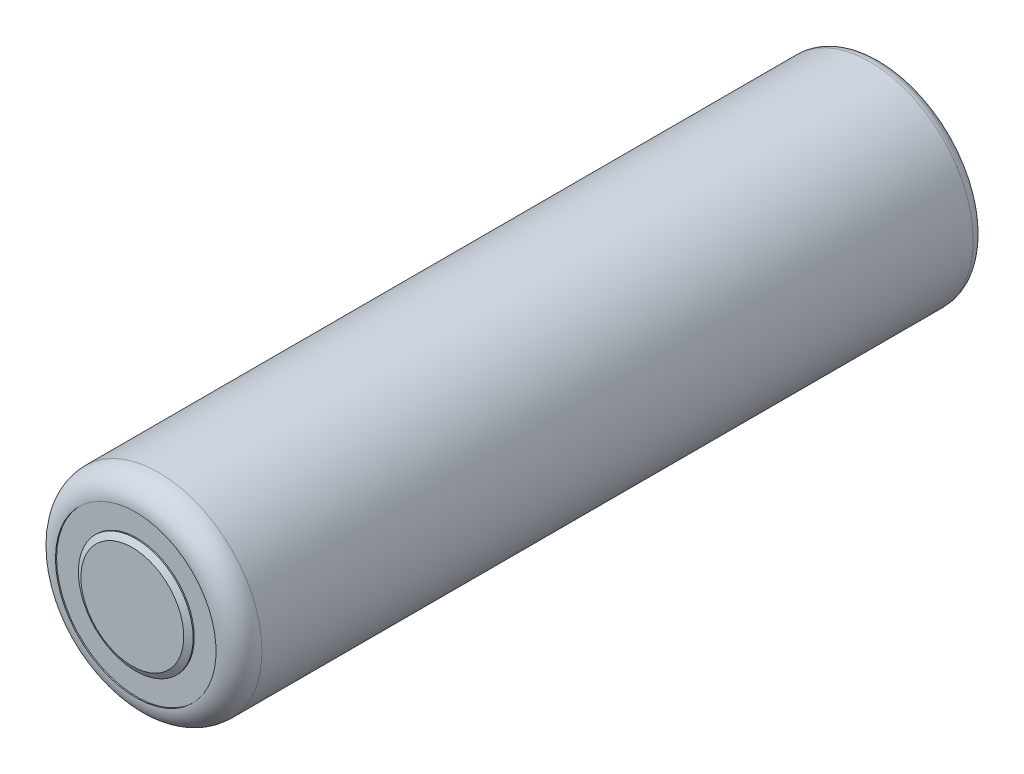
ISO-10303-21;
HEADER;
FILE_DESCRIPTION(('STEP AP214'),'2;1');
FILE_NAME('part.step','',(''),(''),'','','');
FILE_SCHEMA(('AUTOMOTIVE_DESIGN { 1 0 10303 214 1 1 1 1 }'));
ENDSEC;
DATA;
#1=APPLICATION_CONTEXT('core data for automotive mechanical design processes');
#2=APPLICATION_PROTOCOL_DEFINITION('international standard','automotive_design',2000,#1);
#3=PRODUCT_CONTEXT('',#1,'mechanical');
#4=PRODUCT('Part','Part','',(#3));
#5=PRODUCT_RELATED_PRODUCT_CATEGORY('part','',(#4));
#6=PRODUCT_DEFINITION_FORMATION('','',#4);
#7=PRODUCT_DEFINITION_CONTEXT('part definition',#1,'design');
#8=PRODUCT_DEFINITION('design','',#6,#7);
#9=PRODUCT_DEFINITION_SHAPE('','',#8);
#10=(LENGTH_UNIT() NAMED_UNIT(*) SI_UNIT(.MILLI.,.METRE.));
#11=(NAMED_UNIT(*) PLANE_ANGLE_UNIT() SI_UNIT($,.RADIAN.));
#12=(NAMED_UNIT(*) SI_UNIT($,.STERADIAN.) SOLID_ANGLE_UNIT());
#13=UNCERTAINTY_MEASURE_WITH_UNIT(LENGTH_MEASURE(1.E-05),#10,'distance_accuracy_value','');
#14=(GEOMETRIC_REPRESENTATION_CONTEXT(3) GLOBAL_UNCERTAINTY_ASSIGNED_CONTEXT((#13)) GLOBAL_UNIT_ASSIGNED_CONTEXT((#10,
#11,#12)) REPRESENTATION_CONTEXT('',''));
#15=CARTESIAN_POINT('',(0.,0.,0.));
#16=DIRECTION('',(0.,0.,1.));
#17=DIRECTION('',(1.,0.,0.));
#18=AXIS2_PLACEMENT_3D('',#15,#16,#17);
#19=CARTESIAN_POINT('',(0.,0.,65.3));
#20=DIRECTION('',(0.,0.,1.));
#21=DIRECTION('',(1.,0.,0.));
#22=AXIS2_PLACEMENT_3D('',#19,#20,#21);
#23=PLANE('',#22);
#24=CARTESIAN_POINT('',(0.,0.,65.3));
#25=DIRECTION('',(0.,0.,-1.));
#26=DIRECTION('',(-1.,0.,0.));
#27=AXIS2_PLACEMENT_3D('',#24,#25,#26);
#28=CIRCLE('',#27,4.48038475772933);
#29=CARTESIAN_POINT('',(4.48038475772933,0.,65.3));
#30=VERTEX_POINT('',#29);
#31=EDGE_CURVE('E28',#30,#30,#28,.T.);
#32=ORIENTED_EDGE('',*,*,#31,.F.);
#33=EDGE_LOOP('',(#32));
#34=FACE_BOUND('',#33,.T.);
#35=ADVANCED_FACE('F17',(#34),#23,.T.);
#36=CARTESIAN_POINT('',(0.,0.,65.));
#37=DIRECTION('',(0.,0.,-1.));
#38=DIRECTION('',(-1.,0.,0.));
#39=AXIS2_PLACEMENT_3D('',#36,#37,#38);
#40=CONICAL_SURFACE('',#39,5.,1.0471975511966);
#41=ORIENTED_EDGE('',*,*,#31,.T.);
#42=DIRECTION('',(0.866025403784439,0.,-0.5));
#43=VECTOR('',#42,1.);
#44=CARTESIAN_POINT('',(5.,0.,65.));
#45=LINE('',#44,#43);
#46=CARTESIAN_POINT('',(5.,0.,65.));
#47=VERTEX_POINT('',#46);
#48=EDGE_CURVE('E10',#30,#47,#45,.T.);
#49=ORIENTED_EDGE('',*,*,#48,.T.);
#50=CARTESIAN_POINT('',(0.,0.,65.));
#51=DIRECTION('',(0.,0.,-1.));
#52=DIRECTION('',(-1.,0.,0.));
#53=AXIS2_PLACEMENT_3D('',#50,#51,#52);
#54=CIRCLE('',#53,5.);
#55=EDGE_CURVE('E104',#47,#47,#54,.T.);
#56=ORIENTED_EDGE('',*,*,#55,.F.);
#57=ORIENTED_EDGE('',*,*,#48,.F.);
#58=EDGE_LOOP('',(#41,#49,#56,#57));
#59=FACE_BOUND('',#58,.T.);
#60=ADVANCED_FACE('F222',(#59),#40,.T.);
#61=CARTESIAN_POINT('',(0.,0.,1.));
#62=DIRECTION('',(0.,0.,1.));
#63=DIRECTION('',(1.,0.,0.));
#64=AXIS2_PLACEMENT_3D('',#61,#62,#63);
#65=TOROIDAL_SURFACE('',#64,8.,1.);
#66=CARTESIAN_POINT('',(0.,0.,1.));
#67=DIRECTION('',(0.,0.,-1.));
#68=DIRECTION('',(1.,0.,0.));
#69=AXIS2_PLACEMENT_3D('',#66,#67,#68);
#70=CIRCLE('',#69,9.);
#71=CARTESIAN_POINT('',(-9.,0.,1.));
#72=VERTEX_POINT('',#71);
#73=EDGE_CURVE('E94',#72,#72,#70,.T.);
#74=ORIENTED_EDGE('',*,*,#73,.T.);
#75=CARTESIAN_POINT('',(-8.,0.,1.));
#76=DIRECTION('',(0.,-1.,0.));
#77=DIRECTION('',(-1.,0.,0.));
#78=AXIS2_PLACEMENT_3D('',#75,#76,#77);
#79=CIRCLE('',#78,1.);
#80=CARTESIAN_POINT('',(-8.,0.,0.));
#81=VERTEX_POINT('',#80);
#82=EDGE_CURVE('E90',#72,#81,#79,.T.);
#83=ORIENTED_EDGE('',*,*,#82,.T.);
#84=CARTESIAN_POINT('',(0.,0.,0.));
#85=DIRECTION('',(0.,0.,1.));
#86=DIRECTION('',(1.,0.,0.));
#87=AXIS2_PLACEMENT_3D('',#84,#85,#86);
#88=CIRCLE('',#87,8.);
#89=EDGE_CURVE('E92',#81,#81,#88,.T.);
#90=ORIENTED_EDGE('',*,*,#89,.T.);
#91=ORIENTED_EDGE('',*,*,#82,.F.);
#92=EDGE_LOOP('',(#74,#83,#90,#91));
#93=FACE_BOUND('',#92,.T.);
#94=ADVANCED_FACE('F19',(#93),#65,.T.);
#95=CARTESIAN_POINT('',(0.,0.,0.));
#96=DIRECTION('',(0.,0.,1.));
#97=DIRECTION('',(1.,0.,0.));
#98=AXIS2_PLACEMENT_3D('',#95,#96,#97);
#99=CYLINDRICAL_SURFACE('',#98,9.);
#100=CARTESIAN_POINT('',(0.,0.,63.));
#101=DIRECTION('',(0.,0.,1.));
#102=DIRECTION('',(1.,0.,0.));
#103=AXIS2_PLACEMENT_3D('',#100,#101,#102);
#104=CIRCLE('',#103,9.);
#105=CARTESIAN_POINT('',(-9.,0.,63.));
#106=VERTEX_POINT('',#105);
#107=EDGE_CURVE('E122',#106,#106,#104,.T.);
#108=ORIENTED_EDGE('',*,*,#107,.F.);
#109=DIRECTION('',(0.,0.,-1.));
#110=VECTOR('',#109,1.);
#111=CARTESIAN_POINT('',(-9.,0.,0.));
#112=LINE('',#111,#110);
#113=EDGE_CURVE('E124',#106,#72,#112,.T.);
#114=ORIENTED_EDGE('',*,*,#113,.T.);
#115=ORIENTED_EDGE('',*,*,#73,.F.);
#116=ORIENTED_EDGE('',*,*,#113,.F.);
#117=EDGE_LOOP('',(#108,#114,#115,#116));
#118=FACE_BOUND('',#117,.T.);
#119=ADVANCED_FACE('F148',(#118),#99,.T.);
#120=CARTESIAN_POINT('',(0.,0.,63.));
#121=DIRECTION('',(0.,0.,1.));
#122=DIRECTION('',(1.,0.,0.));
#123=AXIS2_PLACEMENT_3D('',#120,#121,#122);
#124=TOROIDAL_SURFACE('',#123,7.,2.);
#125=CARTESIAN_POINT('',(0.,0.,65.));
#126=DIRECTION('',(0.,0.,-1.));
#127=DIRECTION('',(1.,0.,0.));
#128=AXIS2_PLACEMENT_3D('',#125,#126,#127);
#129=CIRCLE('',#128,7.);
#130=CARTESIAN_POINT('',(-7.,0.,65.));
#131=VERTEX_POINT('',#130);
#132=EDGE_CURVE('E128',#131,#131,#129,.T.);
#133=ORIENTED_EDGE('',*,*,#132,.T.);
#134=CARTESIAN_POINT('',(-7.,0.,63.));
#135=DIRECTION('',(0.,-1.,0.));
#136=DIRECTION('',(-1.,0.,0.));
#137=AXIS2_PLACEMENT_3D('',#134,#135,#136);
#138=CIRCLE('',#137,2.);
#139=EDGE_CURVE('E56',#131,#106,#138,.T.);
#140=ORIENTED_EDGE('',*,*,#139,.T.);
#141=ORIENTED_EDGE('',*,*,#107,.T.);
#142=ORIENTED_EDGE('',*,*,#139,.F.);
#143=EDGE_LOOP('',(#133,#140,#141,#142));
#144=FACE_BOUND('',#143,.T.);
#145=ADVANCED_FACE('F145',(#144),#124,.T.);
#146=CARTESIAN_POINT('',(0.,0.,64.9));
#147=DIRECTION('',(0.,0.,1.));
#148=DIRECTION('',(1.,0.,0.));
#149=AXIS2_PLACEMENT_3D('',#146,#147,#148);
#150=PLANE('',#149);
#151=CARTESIAN_POINT('',(0.,0.,64.9));
#152=DIRECTION('',(0.,0.,1.));
#153=DIRECTION('',(-1.,0.,0.));
#154=AXIS2_PLACEMENT_3D('',#151,#152,#153);
#155=CIRCLE('',#154,5.);
#156=CARTESIAN_POINT('',(5.,0.,64.9));
#157=VERTEX_POINT('',#156);
#158=EDGE_CURVE('E69',#157,#157,#155,.T.);
#159=ORIENTED_EDGE('',*,*,#158,.F.);
#160=EDGE_LOOP('',(#159));
#161=FACE_BOUND('',#160,.T.);
#162=CARTESIAN_POINT('',(0.,0.,64.9));
#163=DIRECTION('',(0.,0.,-1.));
#164=DIRECTION('',(1.,0.,0.));
#165=AXIS2_PLACEMENT_3D('',#162,#163,#164);
#166=CIRCLE('',#165,7.);
#167=CARTESIAN_POINT('',(-7.,0.,64.9));
#168=VERTEX_POINT('',#167);
#169=EDGE_CURVE('E116',#168,#168,#166,.T.);
#170=ORIENTED_EDGE('',*,*,#169,.F.);
#171=EDGE_LOOP('',(#170));
#172=FACE_BOUND('',#171,.T.);
#173=ADVANCED_FACE('F192',(#161,#172),#150,.T.);
#174=CARTESIAN_POINT('',(0.,0.,65.));
#175=DIRECTION('',(0.,0.,-1.));
#176=DIRECTION('',(1.,0.,0.));
#177=AXIS2_PLACEMENT_3D('',#174,#175,#176);
#178=CYLINDRICAL_SURFACE('',#177,7.);
#179=ORIENTED_EDGE('',*,*,#132,.F.);
#180=DIRECTION('',(0.,0.,-1.));
#181=VECTOR('',#180,1.);
#182=CARTESIAN_POINT('',(-7.,0.,65.));
#183=LINE('',#182,#181);
#184=EDGE_CURVE('E118',#131,#168,#183,.T.);
#185=ORIENTED_EDGE('',*,*,#184,.T.);
#186=ORIENTED_EDGE('',*,*,#169,.T.);
#187=ORIENTED_EDGE('',*,*,#184,.F.);
#188=EDGE_LOOP('',(#179,#185,#186,#187));
#189=FACE_BOUND('',#188,.T.);
#190=ADVANCED_FACE('F185',(#189),#178,.F.);
#191=CARTESIAN_POINT('',(0.,0.,65.));
#192=DIRECTION('',(0.,0.,-1.));
#193=DIRECTION('',(-1.,0.,0.));
#194=AXIS2_PLACEMENT_3D('',#191,#192,#193);
#195=CYLINDRICAL_SURFACE('',#194,5.);
#196=ORIENTED_EDGE('',*,*,#55,.T.);
#197=DIRECTION('',(0.,0.,-1.));
#198=VECTOR('',#197,1.);
#199=CARTESIAN_POINT('',(5.,0.,65.));
#200=LINE('',#199,#198);
#201=EDGE_CURVE('E115',#47,#157,#200,.T.);
#202=ORIENTED_EDGE('',*,*,#201,.T.);
#203=ORIENTED_EDGE('',*,*,#158,.T.);
#204=ORIENTED_EDGE('',*,*,#201,.F.);
#205=EDGE_LOOP('',(#196,#202,#203,#204));
#206=FACE_BOUND('',#205,.T.);
#207=ADVANCED_FACE('F191',(#206),#195,.T.);
#208=CARTESIAN_POINT('',(0.,0.,0.1));
#209=DIRECTION('',(0.,0.,1.));
#210=DIRECTION('',(1.,0.,0.));
#211=AXIS2_PLACEMENT_3D('',#208,#209,#210);
#212=PLANE('',#211);
#213=CARTESIAN_POINT('',(0.,0.,0.1));
#214=DIRECTION('',(0.,0.,1.));
#215=DIRECTION('',(1.,0.,0.));
#216=AXIS2_PLACEMENT_3D('',#213,#214,#215);
#217=CIRCLE('',#216,8.);
#218=CARTESIAN_POINT('',(-8.,0.,0.1));
#219=VERTEX_POINT('',#218);
#220=EDGE_CURVE('E83',#219,#219,#217,.T.);
#221=ORIENTED_EDGE('',*,*,#220,.F.);
#222=EDGE_LOOP('',(#221));
#223=FACE_BOUND('',#222,.T.);
#224=ADVANCED_FACE('F176',(#223),#212,.F.);
#225=CARTESIAN_POINT('',(0.,0.,0.));
#226=DIRECTION('',(0.,0.,1.));
#227=DIRECTION('',(1.,0.,0.));
#228=AXIS2_PLACEMENT_3D('',#225,#226,#227);
#229=CYLINDRICAL_SURFACE('',#228,8.);
#230=ORIENTED_EDGE('',*,*,#89,.F.);
#231=DIRECTION('',(0.,0.,1.));
#232=VECTOR('',#231,1.);
#233=CARTESIAN_POINT('',(-8.,0.,0.));
#234=LINE('',#233,#232);
#235=EDGE_CURVE('E21',#81,#219,#234,.T.);
#236=ORIENTED_EDGE('',*,*,#235,.T.);
#237=ORIENTED_EDGE('',*,*,#220,.T.);
#238=ORIENTED_EDGE('',*,*,#235,.F.);
#239=EDGE_LOOP('',(#230,#236,#237,#238));
#240=FACE_BOUND('',#239,.T.);
#241=ADVANCED_FACE('F97',(#240),#229,.F.);
#242=CLOSED_SHELL('',(#35,#60,#94,#119,#145,#173,#190,#207,#224,#241));
#243=MANIFOLD_SOLID_BREP('B1',#242);
#244=ADVANCED_BREP_SHAPE_REPRESENTATION('',(#18,#243),#14);
#245=SHAPE_DEFINITION_REPRESENTATION(#9,#244);
ENDSEC;
END-ISO-10303-21;
